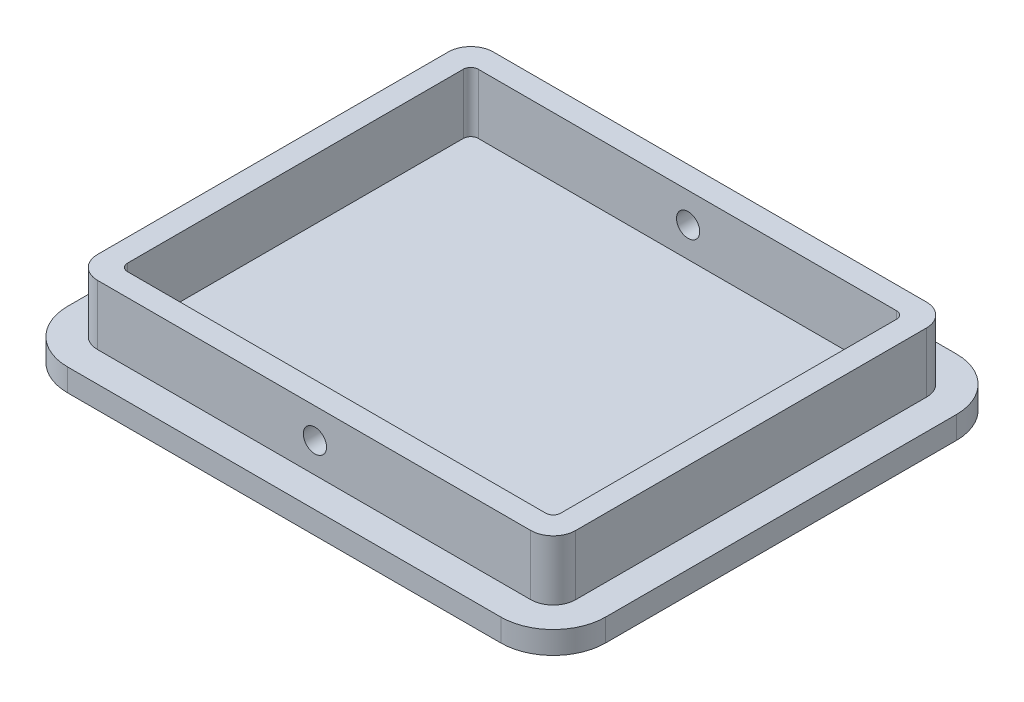
ISO-10303-21;
HEADER;
FILE_DESCRIPTION(('STEP AP214'),'2;1');
FILE_NAME('part.step','',(''),(''),'','','');
FILE_SCHEMA(('AUTOMOTIVE_DESIGN { 1 0 10303 214 1 1 1 1 }'));
ENDSEC;
DATA;
#1=APPLICATION_CONTEXT('core data for automotive mechanical design processes');
#2=APPLICATION_PROTOCOL_DEFINITION('international standard','automotive_design',2000,#1);
#3=PRODUCT_CONTEXT('',#1,'mechanical');
#4=PRODUCT('Part','Part','',(#3));
#5=PRODUCT_RELATED_PRODUCT_CATEGORY('part','',(#4));
#6=PRODUCT_DEFINITION_FORMATION('','',#4);
#7=PRODUCT_DEFINITION_CONTEXT('part definition',#1,'design');
#8=PRODUCT_DEFINITION('design','',#6,#7);
#9=PRODUCT_DEFINITION_SHAPE('','',#8);
#10=(LENGTH_UNIT() NAMED_UNIT(*) SI_UNIT(.MILLI.,.METRE.));
#11=(NAMED_UNIT(*) PLANE_ANGLE_UNIT() SI_UNIT($,.RADIAN.));
#12=(NAMED_UNIT(*) SI_UNIT($,.STERADIAN.) SOLID_ANGLE_UNIT());
#13=UNCERTAINTY_MEASURE_WITH_UNIT(LENGTH_MEASURE(1.E-05),#10,'distance_accuracy_value','');
#14=(GEOMETRIC_REPRESENTATION_CONTEXT(3) GLOBAL_UNCERTAINTY_ASSIGNED_CONTEXT((#13)) GLOBAL_UNIT_ASSIGNED_CONTEXT((#10,
#11,#12)) REPRESENTATION_CONTEXT('',''));
#15=CARTESIAN_POINT('',(0.,0.,0.));
#16=DIRECTION('',(0.,0.,1.));
#17=DIRECTION('',(1.,0.,0.));
#18=AXIS2_PLACEMENT_3D('',#15,#16,#17);
#19=CARTESIAN_POINT('',(28.9,0.,-23.4));
#20=DIRECTION('',(0.,-1.,0.));
#21=DIRECTION('',(0.,0.,-1.));
#22=AXIS2_PLACEMENT_3D('',#19,#20,#21);
#23=PLANE('',#22);
#24=DIRECTION('',(0.,0.,-1.));
#25=VECTOR('',#24,1.);
#26=CARTESIAN_POINT('',(31.9,0.,26.4));
#27=LINE('',#26,#25);
#28=CARTESIAN_POINT('',(31.9,0.,23.4));
#29=VERTEX_POINT('',#28);
#30=CARTESIAN_POINT('',(31.9,0.,-23.4));
#31=VERTEX_POINT('',#30);
#32=EDGE_CURVE('E271',#29,#31,#27,.T.);
#33=ORIENTED_EDGE('',*,*,#32,.F.);
#34=CARTESIAN_POINT('',(28.9,0.,23.4));
#35=DIRECTION('',(0.,-1.,0.));
#36=DIRECTION('',(0.,0.,-1.));
#37=AXIS2_PLACEMENT_3D('',#34,#35,#36);
#38=CIRCLE('',#37,3.);
#39=CARTESIAN_POINT('',(28.9,0.,26.4));
#40=VERTEX_POINT('',#39);
#41=EDGE_CURVE('E177',#29,#40,#38,.T.);
#42=ORIENTED_EDGE('',*,*,#41,.T.);
#43=DIRECTION('',(1.,0.,0.));
#44=VECTOR('',#43,1.);
#45=CARTESIAN_POINT('',(-31.9,0.,26.4));
#46=LINE('',#45,#44);
#47=CARTESIAN_POINT('',(-28.9,0.,26.4));
#48=VERTEX_POINT('',#47);
#49=EDGE_CURVE('E300',#48,#40,#46,.T.);
#50=ORIENTED_EDGE('',*,*,#49,.F.);
#51=CARTESIAN_POINT('',(-28.9,0.,23.4));
#52=DIRECTION('',(0.,-1.,0.));
#53=DIRECTION('',(0.,0.,-1.));
#54=AXIS2_PLACEMENT_3D('',#51,#52,#53);
#55=CIRCLE('',#54,3.);
#56=CARTESIAN_POINT('',(-31.9,0.,23.4));
#57=VERTEX_POINT('',#56);
#58=EDGE_CURVE('E239',#48,#57,#55,.T.);
#59=ORIENTED_EDGE('',*,*,#58,.T.);
#60=DIRECTION('',(0.,0.,1.));
#61=VECTOR('',#60,1.);
#62=CARTESIAN_POINT('',(-31.9,0.,26.4));
#63=LINE('',#62,#61);
#64=CARTESIAN_POINT('',(-31.9,0.,-23.4));
#65=VERTEX_POINT('',#64);
#66=EDGE_CURVE('E287',#65,#57,#63,.T.);
#67=ORIENTED_EDGE('',*,*,#66,.F.);
#68=CARTESIAN_POINT('',(-28.9,0.,-23.4));
#69=DIRECTION('',(0.,-1.,0.));
#70=DIRECTION('',(0.,0.,-1.));
#71=AXIS2_PLACEMENT_3D('',#68,#69,#70);
#72=CIRCLE('',#71,3.);
#73=CARTESIAN_POINT('',(-28.9,0.,-26.4));
#74=VERTEX_POINT('',#73);
#75=EDGE_CURVE('E240',#65,#74,#72,.T.);
#76=ORIENTED_EDGE('',*,*,#75,.T.);
#77=DIRECTION('',(-1.,0.,0.));
#78=VECTOR('',#77,1.);
#79=CARTESIAN_POINT('',(-31.9,0.,-26.4));
#80=LINE('',#79,#78);
#81=CARTESIAN_POINT('',(28.9,0.,-26.4));
#82=VERTEX_POINT('',#81);
#83=EDGE_CURVE('E256',#82,#74,#80,.T.);
#84=ORIENTED_EDGE('',*,*,#83,.F.);
#85=CARTESIAN_POINT('',(28.9,0.,-23.4));
#86=DIRECTION('',(0.,-1.,0.));
#87=DIRECTION('',(0.,0.,-1.));
#88=AXIS2_PLACEMENT_3D('',#85,#86,#87);
#89=CIRCLE('',#88,3.);
#90=EDGE_CURVE('E241',#82,#31,#89,.T.);
#91=ORIENTED_EDGE('',*,*,#90,.T.);
#92=EDGE_LOOP('',(#33,#42,#50,#59,#67,#76,#84,#91));
#93=FACE_BOUND('',#92,.T.);
#94=CARTESIAN_POINT('',(28.9,0.,-23.4));
#95=DIRECTION('',(0.,-1.,0.));
#96=DIRECTION('',(0.,0.,-1.));
#97=AXIS2_PLACEMENT_3D('',#94,#95,#96);
#98=CIRCLE('',#97,7.);
#99=CARTESIAN_POINT('',(28.9,0.,-30.4));
#100=VERTEX_POINT('',#99);
#101=CARTESIAN_POINT('',(35.9,0.,-23.4));
#102=VERTEX_POINT('',#101);
#103=EDGE_CURVE('E144',#100,#102,#98,.T.);
#104=ORIENTED_EDGE('',*,*,#103,.F.);
#105=DIRECTION('',(1.,0.,0.));
#106=VECTOR('',#105,1.);
#107=CARTESIAN_POINT('',(-28.9,0.,-30.4));
#108=LINE('',#107,#106);
#109=CARTESIAN_POINT('',(-28.9,0.,-30.4));
#110=VERTEX_POINT('',#109);
#111=EDGE_CURVE('E27',#110,#100,#108,.T.);
#112=ORIENTED_EDGE('',*,*,#111,.F.);
#113=CARTESIAN_POINT('',(-28.9,0.,-23.4));
#114=DIRECTION('',(0.,-1.,0.));
#115=DIRECTION('',(0.,0.,-1.));
#116=AXIS2_PLACEMENT_3D('',#113,#114,#115);
#117=CIRCLE('',#116,7.);
#118=CARTESIAN_POINT('',(-35.9,0.,-23.4));
#119=VERTEX_POINT('',#118);
#120=EDGE_CURVE('E85',#119,#110,#117,.T.);
#121=ORIENTED_EDGE('',*,*,#120,.F.);
#122=DIRECTION('',(0.,0.,-1.));
#123=VECTOR('',#122,1.);
#124=CARTESIAN_POINT('',(-35.9,0.,23.4));
#125=LINE('',#124,#123);
#126=CARTESIAN_POINT('',(-35.9,0.,23.4));
#127=VERTEX_POINT('',#126);
#128=EDGE_CURVE('E114',#127,#119,#125,.T.);
#129=ORIENTED_EDGE('',*,*,#128,.F.);
#130=CARTESIAN_POINT('',(-28.9,0.,23.4));
#131=DIRECTION('',(0.,-1.,0.));
#132=DIRECTION('',(0.,0.,-1.));
#133=AXIS2_PLACEMENT_3D('',#130,#131,#132);
#134=CIRCLE('',#133,7.);
#135=CARTESIAN_POINT('',(-28.9,0.,30.4));
#136=VERTEX_POINT('',#135);
#137=EDGE_CURVE('E123',#136,#127,#134,.T.);
#138=ORIENTED_EDGE('',*,*,#137,.F.);
#139=DIRECTION('',(-1.,0.,0.));
#140=VECTOR('',#139,1.);
#141=CARTESIAN_POINT('',(28.9,0.,30.4));
#142=LINE('',#141,#140);
#143=CARTESIAN_POINT('',(28.9,0.,30.4));
#144=VERTEX_POINT('',#143);
#145=EDGE_CURVE('E384',#144,#136,#142,.T.);
#146=ORIENTED_EDGE('',*,*,#145,.F.);
#147=CARTESIAN_POINT('',(28.9,0.,23.4));
#148=DIRECTION('',(0.,-1.,0.));
#149=DIRECTION('',(0.,0.,-1.));
#150=AXIS2_PLACEMENT_3D('',#147,#148,#149);
#151=CIRCLE('',#150,7.);
#152=CARTESIAN_POINT('',(35.9,0.,23.4));
#153=VERTEX_POINT('',#152);
#154=EDGE_CURVE('E200',#153,#144,#151,.T.);
#155=ORIENTED_EDGE('',*,*,#154,.F.);
#156=DIRECTION('',(0.,0.,1.));
#157=VECTOR('',#156,1.);
#158=CARTESIAN_POINT('',(35.9,0.,-23.4));
#159=LINE('',#158,#157);
#160=EDGE_CURVE('E146',#102,#153,#159,.T.);
#161=ORIENTED_EDGE('',*,*,#160,.F.);
#162=EDGE_LOOP('',(#104,#112,#121,#129,#138,#146,#155,#161));
#163=FACE_BOUND('',#162,.T.);
#164=ADVANCED_FACE('F16',(#93,#163),#23,.F.);
#165=CARTESIAN_POINT('',(28.9,-3.,-23.4));
#166=DIRECTION('',(0.,-1.,0.));
#167=DIRECTION('',(0.,0.,-1.));
#168=AXIS2_PLACEMENT_3D('',#165,#166,#167);
#169=PLANE('',#168);
#170=CARTESIAN_POINT('',(28.9,-3.,-23.4));
#171=DIRECTION('',(0.,-1.,0.));
#172=DIRECTION('',(0.,0.,-1.));
#173=AXIS2_PLACEMENT_3D('',#170,#171,#172);
#174=CIRCLE('',#173,7.);
#175=CARTESIAN_POINT('',(28.9,-3.,-30.4));
#176=VERTEX_POINT('',#175);
#177=CARTESIAN_POINT('',(35.9,-3.,-23.4));
#178=VERTEX_POINT('',#177);
#179=EDGE_CURVE('E148',#176,#178,#174,.T.);
#180=ORIENTED_EDGE('',*,*,#179,.T.);
#181=DIRECTION('',(0.,0.,1.));
#182=VECTOR('',#181,1.);
#183=CARTESIAN_POINT('',(35.9,-3.,-23.4));
#184=LINE('',#183,#182);
#185=CARTESIAN_POINT('',(35.9,-3.,23.4));
#186=VERTEX_POINT('',#185);
#187=EDGE_CURVE('E204',#178,#186,#184,.T.);
#188=ORIENTED_EDGE('',*,*,#187,.T.);
#189=CARTESIAN_POINT('',(28.9,-3.,23.4));
#190=DIRECTION('',(0.,-1.,0.));
#191=DIRECTION('',(0.,0.,-1.));
#192=AXIS2_PLACEMENT_3D('',#189,#190,#191);
#193=CIRCLE('',#192,7.);
#194=CARTESIAN_POINT('',(28.9,-3.,30.4));
#195=VERTEX_POINT('',#194);
#196=EDGE_CURVE('E381',#186,#195,#193,.T.);
#197=ORIENTED_EDGE('',*,*,#196,.T.);
#198=DIRECTION('',(-1.,0.,0.));
#199=VECTOR('',#198,1.);
#200=CARTESIAN_POINT('',(28.9,-3.,30.4));
#201=LINE('',#200,#199);
#202=CARTESIAN_POINT('',(-28.9,-3.,30.4));
#203=VERTEX_POINT('',#202);
#204=EDGE_CURVE('E392',#195,#203,#201,.T.);
#205=ORIENTED_EDGE('',*,*,#204,.T.);
#206=CARTESIAN_POINT('',(-28.9,-3.,23.4));
#207=DIRECTION('',(0.,-1.,0.));
#208=DIRECTION('',(0.,0.,-1.));
#209=AXIS2_PLACEMENT_3D('',#206,#207,#208);
#210=CIRCLE('',#209,7.);
#211=CARTESIAN_POINT('',(-35.9,-3.,23.4));
#212=VERTEX_POINT('',#211);
#213=EDGE_CURVE('E106',#203,#212,#210,.T.);
#214=ORIENTED_EDGE('',*,*,#213,.T.);
#215=DIRECTION('',(0.,0.,-1.));
#216=VECTOR('',#215,1.);
#217=CARTESIAN_POINT('',(-35.9,-3.,23.4));
#218=LINE('',#217,#216);
#219=CARTESIAN_POINT('',(-35.9,-3.,-23.4));
#220=VERTEX_POINT('',#219);
#221=EDGE_CURVE('E101',#212,#220,#218,.T.);
#222=ORIENTED_EDGE('',*,*,#221,.T.);
#223=CARTESIAN_POINT('',(-28.9,-3.,-23.4));
#224=DIRECTION('',(0.,-1.,0.));
#225=DIRECTION('',(0.,0.,-1.));
#226=AXIS2_PLACEMENT_3D('',#223,#224,#225);
#227=CIRCLE('',#226,7.);
#228=CARTESIAN_POINT('',(-28.9,-3.,-30.4));
#229=VERTEX_POINT('',#228);
#230=EDGE_CURVE('E89',#220,#229,#227,.T.);
#231=ORIENTED_EDGE('',*,*,#230,.T.);
#232=DIRECTION('',(1.,0.,0.));
#233=VECTOR('',#232,1.);
#234=CARTESIAN_POINT('',(-28.9,-3.,-30.4));
#235=LINE('',#234,#233);
#236=EDGE_CURVE('E10',#229,#176,#235,.T.);
#237=ORIENTED_EDGE('',*,*,#236,.T.);
#238=EDGE_LOOP('',(#180,#188,#197,#205,#214,#222,#231,#237));
#239=FACE_BOUND('',#238,.T.);
#240=ADVANCED_FACE('F103',(#239),#169,.T.);
#241=CARTESIAN_POINT('',(-28.9,-3.,-30.4));
#242=DIRECTION('',(0.,0.,1.));
#243=DIRECTION('',(1.,0.,0.));
#244=AXIS2_PLACEMENT_3D('',#241,#242,#243);
#245=PLANE('',#244);
#246=ORIENTED_EDGE('',*,*,#111,.T.);
#247=DIRECTION('',(0.,1.,0.));
#248=VECTOR('',#247,1.);
#249=CARTESIAN_POINT('',(28.9,-3.,-30.4));
#250=LINE('',#249,#248);
#251=EDGE_CURVE('E133',#176,#100,#250,.T.);
#252=ORIENTED_EDGE('',*,*,#251,.F.);
#253=ORIENTED_EDGE('',*,*,#236,.F.);
#254=DIRECTION('',(0.,1.,0.));
#255=VECTOR('',#254,1.);
#256=CARTESIAN_POINT('',(-28.9,-3.,-30.4));
#257=LINE('',#256,#255);
#258=EDGE_CURVE('E96',#229,#110,#257,.T.);
#259=ORIENTED_EDGE('',*,*,#258,.T.);
#260=EDGE_LOOP('',(#246,#252,#253,#259));
#261=FACE_BOUND('',#260,.T.);
#262=ADVANCED_FACE('F18',(#261),#245,.F.);
#263=CARTESIAN_POINT('',(-28.9,-3.,-23.4));
#264=DIRECTION('',(0.,1.,0.));
#265=DIRECTION('',(0.,0.,1.));
#266=AXIS2_PLACEMENT_3D('',#263,#264,#265);
#267=CYLINDRICAL_SURFACE('',#266,7.);
#268=ORIENTED_EDGE('',*,*,#120,.T.);
#269=ORIENTED_EDGE('',*,*,#258,.F.);
#270=ORIENTED_EDGE('',*,*,#230,.F.);
#271=DIRECTION('',(0.,1.,0.));
#272=VECTOR('',#271,1.);
#273=CARTESIAN_POINT('',(-35.9,-3.,-23.4));
#274=LINE('',#273,#272);
#275=EDGE_CURVE('E94',#220,#119,#274,.T.);
#276=ORIENTED_EDGE('',*,*,#275,.T.);
#277=EDGE_LOOP('',(#268,#269,#270,#276));
#278=FACE_BOUND('',#277,.T.);
#279=ADVANCED_FACE('F95',(#278),#267,.T.);
#280=CARTESIAN_POINT('',(-35.9,-3.,23.4));
#281=DIRECTION('',(1.,0.,0.));
#282=DIRECTION('',(0.,1.,0.));
#283=AXIS2_PLACEMENT_3D('',#280,#281,#282);
#284=PLANE('',#283);
#285=ORIENTED_EDGE('',*,*,#128,.T.);
#286=ORIENTED_EDGE('',*,*,#275,.F.);
#287=ORIENTED_EDGE('',*,*,#221,.F.);
#288=DIRECTION('',(0.,1.,0.));
#289=VECTOR('',#288,1.);
#290=CARTESIAN_POINT('',(-35.9,-3.,23.4));
#291=LINE('',#290,#289);
#292=EDGE_CURVE('E314',#212,#127,#291,.T.);
#293=ORIENTED_EDGE('',*,*,#292,.T.);
#294=EDGE_LOOP('',(#285,#286,#287,#293));
#295=FACE_BOUND('',#294,.T.);
#296=ADVANCED_FACE('F115',(#295),#284,.F.);
#297=CARTESIAN_POINT('',(-28.9,-3.,23.4));
#298=DIRECTION('',(0.,1.,0.));
#299=DIRECTION('',(0.,0.,1.));
#300=AXIS2_PLACEMENT_3D('',#297,#298,#299);
#301=CYLINDRICAL_SURFACE('',#300,7.);
#302=ORIENTED_EDGE('',*,*,#137,.T.);
#303=ORIENTED_EDGE('',*,*,#292,.F.);
#304=ORIENTED_EDGE('',*,*,#213,.F.);
#305=DIRECTION('',(0.,1.,0.));
#306=VECTOR('',#305,1.);
#307=CARTESIAN_POINT('',(-28.9,-3.,30.4));
#308=LINE('',#307,#306);
#309=EDGE_CURVE('E386',#203,#136,#308,.T.);
#310=ORIENTED_EDGE('',*,*,#309,.T.);
#311=EDGE_LOOP('',(#302,#303,#304,#310));
#312=FACE_BOUND('',#311,.T.);
#313=ADVANCED_FACE('F401',(#312),#301,.T.);
#314=CARTESIAN_POINT('',(28.9,-3.,30.4));
#315=DIRECTION('',(0.,0.,-1.));
#316=DIRECTION('',(0.,-1.,0.));
#317=AXIS2_PLACEMENT_3D('',#314,#315,#316);
#318=PLANE('',#317);
#319=ORIENTED_EDGE('',*,*,#145,.T.);
#320=ORIENTED_EDGE('',*,*,#309,.F.);
#321=ORIENTED_EDGE('',*,*,#204,.F.);
#322=DIRECTION('',(0.,1.,0.));
#323=VECTOR('',#322,1.);
#324=CARTESIAN_POINT('',(28.9,-3.,30.4));
#325=LINE('',#324,#323);
#326=EDGE_CURVE('E201',#195,#144,#325,.T.);
#327=ORIENTED_EDGE('',*,*,#326,.T.);
#328=EDGE_LOOP('',(#319,#320,#321,#327));
#329=FACE_BOUND('',#328,.T.);
#330=ADVANCED_FACE('F404',(#329),#318,.F.);
#331=CARTESIAN_POINT('',(28.9,-3.,23.4));
#332=DIRECTION('',(0.,1.,0.));
#333=DIRECTION('',(0.,0.,1.));
#334=AXIS2_PLACEMENT_3D('',#331,#332,#333);
#335=CYLINDRICAL_SURFACE('',#334,7.);
#336=ORIENTED_EDGE('',*,*,#154,.T.);
#337=ORIENTED_EDGE('',*,*,#326,.F.);
#338=ORIENTED_EDGE('',*,*,#196,.F.);
#339=DIRECTION('',(0.,1.,0.));
#340=VECTOR('',#339,1.);
#341=CARTESIAN_POINT('',(35.9,-3.,23.4));
#342=LINE('',#341,#340);
#343=EDGE_CURVE('E249',#186,#153,#342,.T.);
#344=ORIENTED_EDGE('',*,*,#343,.T.);
#345=EDGE_LOOP('',(#336,#337,#338,#344));
#346=FACE_BOUND('',#345,.T.);
#347=ADVANCED_FACE('F410',(#346),#335,.T.);
#348=CARTESIAN_POINT('',(35.9,-3.,-23.4));
#349=DIRECTION('',(-1.,0.,0.));
#350=DIRECTION('',(0.,0.,1.));
#351=AXIS2_PLACEMENT_3D('',#348,#349,#350);
#352=PLANE('',#351);
#353=ORIENTED_EDGE('',*,*,#160,.T.);
#354=ORIENTED_EDGE('',*,*,#343,.F.);
#355=ORIENTED_EDGE('',*,*,#187,.F.);
#356=DIRECTION('',(0.,1.,0.));
#357=VECTOR('',#356,1.);
#358=CARTESIAN_POINT('',(35.9,-3.,-23.4));
#359=LINE('',#358,#357);
#360=EDGE_CURVE('E154',#178,#102,#359,.T.);
#361=ORIENTED_EDGE('',*,*,#360,.T.);
#362=EDGE_LOOP('',(#353,#354,#355,#361));
#363=FACE_BOUND('',#362,.T.);
#364=ADVANCED_FACE('F413',(#363),#352,.F.);
#365=CARTESIAN_POINT('',(28.9,-3.,-23.4));
#366=DIRECTION('',(0.,1.,0.));
#367=DIRECTION('',(0.,0.,1.));
#368=AXIS2_PLACEMENT_3D('',#365,#366,#367);
#369=CYLINDRICAL_SURFACE('',#368,7.);
#370=ORIENTED_EDGE('',*,*,#103,.T.);
#371=ORIENTED_EDGE('',*,*,#360,.F.);
#372=ORIENTED_EDGE('',*,*,#179,.F.);
#373=ORIENTED_EDGE('',*,*,#251,.T.);
#374=EDGE_LOOP('',(#370,#371,#372,#373));
#375=FACE_BOUND('',#374,.T.);
#376=ADVANCED_FACE('F141',(#375),#369,.T.);
#377=CARTESIAN_POINT('',(28.9,0.,-23.4));
#378=DIRECTION('',(0.,-1.,0.));
#379=DIRECTION('',(0.,0.,-1.));
#380=AXIS2_PLACEMENT_3D('',#377,#378,#379);
#381=PLANE('',#380);
#382=CARTESIAN_POINT('',(27.9,0.,22.4));
#383=DIRECTION('',(0.,1.,0.));
#384=DIRECTION('',(0.,0.,-1.));
#385=AXIS2_PLACEMENT_3D('',#382,#383,#384);
#386=CIRCLE('',#385,1.);
#387=CARTESIAN_POINT('',(27.9,0.,23.4));
#388=VERTEX_POINT('',#387);
#389=CARTESIAN_POINT('',(28.9,0.,22.4));
#390=VERTEX_POINT('',#389);
#391=EDGE_CURVE('E362',#388,#390,#386,.T.);
#392=ORIENTED_EDGE('',*,*,#391,.T.);
#393=DIRECTION('',(0.,0.,-1.));
#394=VECTOR('',#393,1.);
#395=CARTESIAN_POINT('',(28.9,0.,23.4));
#396=LINE('',#395,#394);
#397=CARTESIAN_POINT('',(28.9,0.,-22.4));
#398=VERTEX_POINT('',#397);
#399=EDGE_CURVE('E217',#390,#398,#396,.T.);
#400=ORIENTED_EDGE('',*,*,#399,.T.);
#401=CARTESIAN_POINT('',(27.9,0.,-22.4));
#402=DIRECTION('',(0.,1.,0.));
#403=DIRECTION('',(0.,0.,-1.));
#404=AXIS2_PLACEMENT_3D('',#401,#402,#403);
#405=CIRCLE('',#404,1.);
#406=CARTESIAN_POINT('',(27.9,0.,-23.4));
#407=VERTEX_POINT('',#406);
#408=EDGE_CURVE('E163',#398,#407,#405,.T.);
#409=ORIENTED_EDGE('',*,*,#408,.T.);
#410=DIRECTION('',(-1.,0.,0.));
#411=VECTOR('',#410,1.);
#412=CARTESIAN_POINT('',(-28.9,0.,-23.4));
#413=LINE('',#412,#411);
#414=CARTESIAN_POINT('',(-27.9,0.,-23.4));
#415=VERTEX_POINT('',#414);
#416=EDGE_CURVE('E344',#407,#415,#413,.T.);
#417=ORIENTED_EDGE('',*,*,#416,.T.);
#418=CARTESIAN_POINT('',(-27.9,0.,-22.4));
#419=DIRECTION('',(0.,1.,0.));
#420=DIRECTION('',(0.,0.,-1.));
#421=AXIS2_PLACEMENT_3D('',#418,#419,#420);
#422=CIRCLE('',#421,1.);
#423=CARTESIAN_POINT('',(-28.9,0.,-22.4));
#424=VERTEX_POINT('',#423);
#425=EDGE_CURVE('E156',#415,#424,#422,.T.);
#426=ORIENTED_EDGE('',*,*,#425,.T.);
#427=DIRECTION('',(0.,0.,1.));
#428=VECTOR('',#427,1.);
#429=CARTESIAN_POINT('',(-28.9,0.,23.4));
#430=LINE('',#429,#428);
#431=CARTESIAN_POINT('',(-28.9,0.,22.4));
#432=VERTEX_POINT('',#431);
#433=EDGE_CURVE('E311',#424,#432,#430,.T.);
#434=ORIENTED_EDGE('',*,*,#433,.T.);
#435=CARTESIAN_POINT('',(-27.9,0.,22.4));
#436=DIRECTION('',(0.,1.,0.));
#437=DIRECTION('',(0.,0.,-1.));
#438=AXIS2_PLACEMENT_3D('',#435,#436,#437);
#439=CIRCLE('',#438,1.);
#440=CARTESIAN_POINT('',(-27.9,0.,23.4));
#441=VERTEX_POINT('',#440);
#442=EDGE_CURVE('E358',#432,#441,#439,.T.);
#443=ORIENTED_EDGE('',*,*,#442,.T.);
#444=DIRECTION('',(1.,0.,0.));
#445=VECTOR('',#444,1.);
#446=CARTESIAN_POINT('',(-28.9,0.,23.4));
#447=LINE('',#446,#445);
#448=EDGE_CURVE('E330',#441,#388,#447,.T.);
#449=ORIENTED_EDGE('',*,*,#448,.T.);
#450=EDGE_LOOP('',(#392,#400,#409,#417,#426,#434,#443,#449));
#451=FACE_BOUND('',#450,.T.);
#452=ADVANCED_FACE('F704',(#451),#381,.F.);
#453=CARTESIAN_POINT('',(-27.9,8.,-22.4));
#454=DIRECTION('',(0.,1.,0.));
#455=DIRECTION('',(0.,0.,1.));
#456=AXIS2_PLACEMENT_3D('',#453,#454,#455);
#457=CYLINDRICAL_SURFACE('',#456,1.);
#458=CARTESIAN_POINT('',(-27.9,8.,-22.4));
#459=DIRECTION('',(0.,-1.,0.));
#460=DIRECTION('',(0.,0.,-1.));
#461=AXIS2_PLACEMENT_3D('',#458,#459,#460);
#462=CIRCLE('',#461,1.);
#463=CARTESIAN_POINT('',(-28.9,8.,-22.4));
#464=VERTEX_POINT('',#463);
#465=CARTESIAN_POINT('',(-27.9,8.,-23.4));
#466=VERTEX_POINT('',#465);
#467=EDGE_CURVE('E220',#464,#466,#462,.T.);
#468=ORIENTED_EDGE('',*,*,#467,.F.);
#469=DIRECTION('',(0.,1.,0.));
#470=VECTOR('',#469,1.);
#471=CARTESIAN_POINT('',(-28.9,8.,-22.4));
#472=LINE('',#471,#470);
#473=EDGE_CURVE('E317',#424,#464,#472,.T.);
#474=ORIENTED_EDGE('',*,*,#473,.F.);
#475=ORIENTED_EDGE('',*,*,#425,.F.);
#476=DIRECTION('',(0.,-1.,0.));
#477=VECTOR('',#476,1.);
#478=CARTESIAN_POINT('',(-27.9,0.,-23.4));
#479=LINE('',#478,#477);
#480=EDGE_CURVE('E175',#466,#415,#479,.T.);
#481=ORIENTED_EDGE('',*,*,#480,.F.);
#482=EDGE_LOOP('',(#468,#474,#475,#481));
#483=FACE_BOUND('',#482,.T.);
#484=ADVANCED_FACE('F714',(#483),#457,.F.);
#485=CARTESIAN_POINT('',(27.9,8.,-22.4));
#486=DIRECTION('',(0.,1.,0.));
#487=DIRECTION('',(0.,0.,1.));
#488=AXIS2_PLACEMENT_3D('',#485,#486,#487);
#489=CYLINDRICAL_SURFACE('',#488,1.);
#490=CARTESIAN_POINT('',(27.9,8.,-22.4));
#491=DIRECTION('',(0.,-1.,0.));
#492=DIRECTION('',(0.,0.,-1.));
#493=AXIS2_PLACEMENT_3D('',#490,#491,#492);
#494=CIRCLE('',#493,1.);
#495=CARTESIAN_POINT('',(27.9,8.,-23.4));
#496=VERTEX_POINT('',#495);
#497=CARTESIAN_POINT('',(28.9,8.,-22.4));
#498=VERTEX_POINT('',#497);
#499=EDGE_CURVE('E231',#496,#498,#494,.T.);
#500=ORIENTED_EDGE('',*,*,#499,.F.);
#501=DIRECTION('',(0.,1.,0.));
#502=VECTOR('',#501,1.);
#503=CARTESIAN_POINT('',(27.9,8.,-23.4));
#504=LINE('',#503,#502);
#505=EDGE_CURVE('E179',#407,#496,#504,.T.);
#506=ORIENTED_EDGE('',*,*,#505,.F.);
#507=ORIENTED_EDGE('',*,*,#408,.F.);
#508=DIRECTION('',(0.,-1.,0.));
#509=VECTOR('',#508,1.);
#510=CARTESIAN_POINT('',(28.9,0.,-22.4));
#511=LINE('',#510,#509);
#512=EDGE_CURVE('E340',#498,#398,#511,.T.);
#513=ORIENTED_EDGE('',*,*,#512,.F.);
#514=EDGE_LOOP('',(#500,#506,#507,#513));
#515=FACE_BOUND('',#514,.T.);
#516=ADVANCED_FACE('F726',(#515),#489,.F.);
#517=CARTESIAN_POINT('',(27.9,8.,22.4));
#518=DIRECTION('',(0.,1.,0.));
#519=DIRECTION('',(0.,0.,1.));
#520=AXIS2_PLACEMENT_3D('',#517,#518,#519);
#521=CYLINDRICAL_SURFACE('',#520,1.);
#522=CARTESIAN_POINT('',(27.9,8.,22.4));
#523=DIRECTION('',(0.,-1.,0.));
#524=DIRECTION('',(0.,0.,-1.));
#525=AXIS2_PLACEMENT_3D('',#522,#523,#524);
#526=CIRCLE('',#525,1.);
#527=CARTESIAN_POINT('',(28.9,8.,22.4));
#528=VERTEX_POINT('',#527);
#529=CARTESIAN_POINT('',(27.9,8.,23.4));
#530=VERTEX_POINT('',#529);
#531=EDGE_CURVE('E244',#528,#530,#526,.T.);
#532=ORIENTED_EDGE('',*,*,#531,.F.);
#533=DIRECTION('',(0.,1.,0.));
#534=VECTOR('',#533,1.);
#535=CARTESIAN_POINT('',(28.9,8.,22.4));
#536=LINE('',#535,#534);
#537=EDGE_CURVE('E225',#390,#528,#536,.T.);
#538=ORIENTED_EDGE('',*,*,#537,.F.);
#539=ORIENTED_EDGE('',*,*,#391,.F.);
#540=DIRECTION('',(0.,-1.,0.));
#541=VECTOR('',#540,1.);
#542=CARTESIAN_POINT('',(27.9,0.,23.4));
#543=LINE('',#542,#541);
#544=EDGE_CURVE('E224',#530,#388,#543,.T.);
#545=ORIENTED_EDGE('',*,*,#544,.F.);
#546=EDGE_LOOP('',(#532,#538,#539,#545));
#547=FACE_BOUND('',#546,.T.);
#548=ADVANCED_FACE('F740',(#547),#521,.F.);
#549=CARTESIAN_POINT('',(-27.9,8.,22.4));
#550=DIRECTION('',(0.,1.,0.));
#551=DIRECTION('',(0.,0.,1.));
#552=AXIS2_PLACEMENT_3D('',#549,#550,#551);
#553=CYLINDRICAL_SURFACE('',#552,1.);
#554=CARTESIAN_POINT('',(-27.9,8.,22.4));
#555=DIRECTION('',(0.,-1.,0.));
#556=DIRECTION('',(0.,0.,-1.));
#557=AXIS2_PLACEMENT_3D('',#554,#555,#556);
#558=CIRCLE('',#557,1.);
#559=CARTESIAN_POINT('',(-27.9,8.,23.4));
#560=VERTEX_POINT('',#559);
#561=CARTESIAN_POINT('',(-28.9,8.,22.4));
#562=VERTEX_POINT('',#561);
#563=EDGE_CURVE('E263',#560,#562,#558,.T.);
#564=ORIENTED_EDGE('',*,*,#563,.F.);
#565=DIRECTION('',(0.,1.,0.));
#566=VECTOR('',#565,1.);
#567=CARTESIAN_POINT('',(-27.9,8.,23.4));
#568=LINE('',#567,#566);
#569=EDGE_CURVE('E332',#441,#560,#568,.T.);
#570=ORIENTED_EDGE('',*,*,#569,.F.);
#571=ORIENTED_EDGE('',*,*,#442,.F.);
#572=DIRECTION('',(0.,-1.,0.));
#573=VECTOR('',#572,1.);
#574=CARTESIAN_POINT('',(-28.9,0.,22.4));
#575=LINE('',#574,#573);
#576=EDGE_CURVE('E310',#562,#432,#575,.T.);
#577=ORIENTED_EDGE('',*,*,#576,.F.);
#578=EDGE_LOOP('',(#564,#570,#571,#577));
#579=FACE_BOUND('',#578,.T.);
#580=ADVANCED_FACE('F746',(#579),#553,.F.);
#581=CARTESIAN_POINT('',(-28.9,8.,23.4));
#582=DIRECTION('',(0.,-1.,0.));
#583=DIRECTION('',(0.,0.,-1.));
#584=AXIS2_PLACEMENT_3D('',#581,#582,#583);
#585=CYLINDRICAL_SURFACE('',#584,3.);
#586=CARTESIAN_POINT('',(-28.9,8.,23.4));
#587=DIRECTION('',(0.,1.,0.));
#588=DIRECTION('',(0.,0.,-1.));
#589=AXIS2_PLACEMENT_3D('',#586,#587,#588);
#590=CIRCLE('',#589,3.);
#591=CARTESIAN_POINT('',(-31.9,8.,23.4));
#592=VERTEX_POINT('',#591);
#593=CARTESIAN_POINT('',(-28.9,8.,26.4));
#594=VERTEX_POINT('',#593);
#595=EDGE_CURVE('E215',#592,#594,#590,.T.);
#596=ORIENTED_EDGE('',*,*,#595,.F.);
#597=DIRECTION('',(0.,1.,0.));
#598=VECTOR('',#597,1.);
#599=CARTESIAN_POINT('',(-31.9,8.,23.4));
#600=LINE('',#599,#598);
#601=EDGE_CURVE('E293',#57,#592,#600,.T.);
#602=ORIENTED_EDGE('',*,*,#601,.F.);
#603=ORIENTED_EDGE('',*,*,#58,.F.);
#604=DIRECTION('',(0.,-1.,0.));
#605=VECTOR('',#604,1.);
#606=CARTESIAN_POINT('',(-28.9,8.,26.4));
#607=LINE('',#606,#605);
#608=EDGE_CURVE('E304',#594,#48,#607,.T.);
#609=ORIENTED_EDGE('',*,*,#608,.F.);
#610=EDGE_LOOP('',(#596,#602,#603,#609));
#611=FACE_BOUND('',#610,.T.);
#612=ADVANCED_FACE('F757',(#611),#585,.T.);
#613=CARTESIAN_POINT('',(-28.9,8.,-23.4));
#614=DIRECTION('',(0.,-1.,0.));
#615=DIRECTION('',(0.,0.,-1.));
#616=AXIS2_PLACEMENT_3D('',#613,#614,#615);
#617=CYLINDRICAL_SURFACE('',#616,3.);
#618=CARTESIAN_POINT('',(-28.9,8.,-23.4));
#619=DIRECTION('',(0.,1.,0.));
#620=DIRECTION('',(0.,0.,-1.));
#621=AXIS2_PLACEMENT_3D('',#618,#619,#620);
#622=CIRCLE('',#621,3.);
#623=CARTESIAN_POINT('',(-28.9,8.,-26.4));
#624=VERTEX_POINT('',#623);
#625=CARTESIAN_POINT('',(-31.9,8.,-23.4));
#626=VERTEX_POINT('',#625);
#627=EDGE_CURVE('E196',#624,#626,#622,.T.);
#628=ORIENTED_EDGE('',*,*,#627,.F.);
#629=DIRECTION('',(0.,1.,0.));
#630=VECTOR('',#629,1.);
#631=CARTESIAN_POINT('',(-28.9,8.,-26.4));
#632=LINE('',#631,#630);
#633=EDGE_CURVE('E281',#74,#624,#632,.T.);
#634=ORIENTED_EDGE('',*,*,#633,.F.);
#635=ORIENTED_EDGE('',*,*,#75,.F.);
#636=DIRECTION('',(0.,-1.,0.));
#637=VECTOR('',#636,1.);
#638=CARTESIAN_POINT('',(-31.9,8.,-23.4));
#639=LINE('',#638,#637);
#640=EDGE_CURVE('E285',#626,#65,#639,.T.);
#641=ORIENTED_EDGE('',*,*,#640,.F.);
#642=EDGE_LOOP('',(#628,#634,#635,#641));
#643=FACE_BOUND('',#642,.T.);
#644=ADVANCED_FACE('F769',(#643),#617,.T.);
#645=CARTESIAN_POINT('',(28.9,8.,-23.4));
#646=DIRECTION('',(0.,-1.,0.));
#647=DIRECTION('',(0.,0.,-1.));
#648=AXIS2_PLACEMENT_3D('',#645,#646,#647);
#649=CYLINDRICAL_SURFACE('',#648,3.);
#650=CARTESIAN_POINT('',(28.9,8.,-23.4));
#651=DIRECTION('',(0.,1.,0.));
#652=DIRECTION('',(0.,0.,-1.));
#653=AXIS2_PLACEMENT_3D('',#650,#651,#652);
#654=CIRCLE('',#653,3.);
#655=CARTESIAN_POINT('',(31.9,8.,-23.4));
#656=VERTEX_POINT('',#655);
#657=CARTESIAN_POINT('',(28.9,8.,-26.4));
#658=VERTEX_POINT('',#657);
#659=EDGE_CURVE('E189',#656,#658,#654,.T.);
#660=ORIENTED_EDGE('',*,*,#659,.F.);
#661=DIRECTION('',(0.,1.,0.));
#662=VECTOR('',#661,1.);
#663=CARTESIAN_POINT('',(31.9,8.,-23.4));
#664=LINE('',#663,#662);
#665=EDGE_CURVE('E259',#31,#656,#664,.T.);
#666=ORIENTED_EDGE('',*,*,#665,.F.);
#667=ORIENTED_EDGE('',*,*,#90,.F.);
#668=DIRECTION('',(0.,-1.,0.));
#669=VECTOR('',#668,1.);
#670=CARTESIAN_POINT('',(28.9,8.,-26.4));
#671=LINE('',#670,#669);
#672=EDGE_CURVE('E255',#658,#82,#671,.T.);
#673=ORIENTED_EDGE('',*,*,#672,.F.);
#674=EDGE_LOOP('',(#660,#666,#667,#673));
#675=FACE_BOUND('',#674,.T.);
#676=ADVANCED_FACE('F782',(#675),#649,.T.);
#677=CARTESIAN_POINT('',(28.9,8.,23.4));
#678=DIRECTION('',(0.,-1.,0.));
#679=DIRECTION('',(0.,0.,-1.));
#680=AXIS2_PLACEMENT_3D('',#677,#678,#679);
#681=CYLINDRICAL_SURFACE('',#680,3.);
#682=CARTESIAN_POINT('',(28.9,8.,23.4));
#683=DIRECTION('',(0.,1.,0.));
#684=DIRECTION('',(0.,0.,-1.));
#685=AXIS2_PLACEMENT_3D('',#682,#683,#684);
#686=CIRCLE('',#685,3.);
#687=CARTESIAN_POINT('',(28.9,8.,26.4));
#688=VERTEX_POINT('',#687);
#689=CARTESIAN_POINT('',(31.9,8.,23.4));
#690=VERTEX_POINT('',#689);
#691=EDGE_CURVE('E185',#688,#690,#686,.T.);
#692=ORIENTED_EDGE('',*,*,#691,.F.);
#693=DIRECTION('',(0.,1.,0.));
#694=VECTOR('',#693,1.);
#695=CARTESIAN_POINT('',(28.9,8.,26.4));
#696=LINE('',#695,#694);
#697=EDGE_CURVE('E301',#40,#688,#696,.T.);
#698=ORIENTED_EDGE('',*,*,#697,.F.);
#699=ORIENTED_EDGE('',*,*,#41,.F.);
#700=DIRECTION('',(0.,-1.,0.));
#701=VECTOR('',#700,1.);
#702=CARTESIAN_POINT('',(31.9,8.,23.4));
#703=LINE('',#702,#701);
#704=EDGE_CURVE('E266',#690,#29,#703,.T.);
#705=ORIENTED_EDGE('',*,*,#704,.F.);
#706=EDGE_LOOP('',(#692,#698,#699,#705));
#707=FACE_BOUND('',#706,.T.);
#708=ADVANCED_FACE('F779',(#707),#681,.T.);
#709=CARTESIAN_POINT('',(-28.9,8.,-23.4));
#710=DIRECTION('',(0.,0.,1.));
#711=DIRECTION('',(1.,0.,0.));
#712=AXIS2_PLACEMENT_3D('',#709,#710,#711);
#713=PLANE('',#712);
#714=CARTESIAN_POINT('',(0.100000000000003,4.,-23.4));
#715=DIRECTION('',(0.,0.,1.));
#716=DIRECTION('',(1.,0.,0.));
#717=AXIS2_PLACEMENT_3D('',#714,#715,#716);
#718=CIRCLE('',#717,1.55);
#719=CARTESIAN_POINT('',(1.65,4.,-23.4));
#720=VERTEX_POINT('',#719);
#721=EDGE_CURVE('E168',#720,#720,#718,.T.);
#722=ORIENTED_EDGE('',*,*,#721,.F.);
#723=EDGE_LOOP('',(#722));
#724=FACE_BOUND('',#723,.T.);
#725=ORIENTED_EDGE('',*,*,#416,.F.);
#726=ORIENTED_EDGE('',*,*,#505,.T.);
#727=DIRECTION('',(-1.,0.,0.));
#728=VECTOR('',#727,1.);
#729=CARTESIAN_POINT('',(-28.9,8.,-23.4));
#730=LINE('',#729,#728);
#731=EDGE_CURVE('E227',#496,#466,#730,.T.);
#732=ORIENTED_EDGE('',*,*,#731,.T.);
#733=ORIENTED_EDGE('',*,*,#480,.T.);
#734=EDGE_LOOP('',(#725,#726,#732,#733));
#735=FACE_BOUND('',#734,.T.);
#736=ADVANCED_FACE('F783',(#724,#735),#713,.T.);
#737=CARTESIAN_POINT('',(28.9,8.,23.4));
#738=DIRECTION('',(-1.,0.,0.));
#739=DIRECTION('',(0.,0.,1.));
#740=AXIS2_PLACEMENT_3D('',#737,#738,#739);
#741=PLANE('',#740);
#742=ORIENTED_EDGE('',*,*,#399,.F.);
#743=ORIENTED_EDGE('',*,*,#537,.T.);
#744=DIRECTION('',(0.,0.,-1.));
#745=VECTOR('',#744,1.);
#746=CARTESIAN_POINT('',(28.9,8.,23.4));
#747=LINE('',#746,#745);
#748=EDGE_CURVE('E234',#528,#498,#747,.T.);
#749=ORIENTED_EDGE('',*,*,#748,.T.);
#750=ORIENTED_EDGE('',*,*,#512,.T.);
#751=EDGE_LOOP('',(#742,#743,#749,#750));
#752=FACE_BOUND('',#751,.T.);
#753=ADVANCED_FACE('F796',(#752),#741,.T.);
#754=CARTESIAN_POINT('',(-28.9,8.,23.4));
#755=DIRECTION('',(0.,0.,-1.));
#756=DIRECTION('',(0.,-1.,0.));
#757=AXIS2_PLACEMENT_3D('',#754,#755,#756);
#758=PLANE('',#757);
#759=CARTESIAN_POINT('',(0.100000000000003,4.,23.4));
#760=DIRECTION('',(0.,0.,-1.));
#761=DIRECTION('',(-1.,0.,0.));
#762=AXIS2_PLACEMENT_3D('',#759,#760,#761);
#763=CIRCLE('',#762,1.55);
#764=CARTESIAN_POINT('',(-1.45,4.,23.4));
#765=VERTEX_POINT('',#764);
#766=EDGE_CURVE('E173',#765,#765,#763,.T.);
#767=ORIENTED_EDGE('',*,*,#766,.F.);
#768=EDGE_LOOP('',(#767));
#769=FACE_BOUND('',#768,.T.);
#770=ORIENTED_EDGE('',*,*,#448,.F.);
#771=ORIENTED_EDGE('',*,*,#569,.T.);
#772=DIRECTION('',(1.,0.,0.));
#773=VECTOR('',#772,1.);
#774=CARTESIAN_POINT('',(-28.9,8.,23.4));
#775=LINE('',#774,#773);
#776=EDGE_CURVE('E247',#560,#530,#775,.T.);
#777=ORIENTED_EDGE('',*,*,#776,.T.);
#778=ORIENTED_EDGE('',*,*,#544,.T.);
#779=EDGE_LOOP('',(#770,#771,#777,#778));
#780=FACE_BOUND('',#779,.T.);
#781=ADVANCED_FACE('F810',(#769,#780),#758,.T.);
#782=CARTESIAN_POINT('',(-28.9,8.,23.4));
#783=DIRECTION('',(1.,0.,0.));
#784=DIRECTION('',(0.,1.,0.));
#785=AXIS2_PLACEMENT_3D('',#782,#783,#784);
#786=PLANE('',#785);
#787=DIRECTION('',(0.,0.,1.));
#788=VECTOR('',#787,1.);
#789=CARTESIAN_POINT('',(-28.9,8.,23.4));
#790=LINE('',#789,#788);
#791=EDGE_CURVE('E213',#464,#562,#790,.T.);
#792=ORIENTED_EDGE('',*,*,#791,.T.);
#793=ORIENTED_EDGE('',*,*,#576,.T.);
#794=ORIENTED_EDGE('',*,*,#433,.F.);
#795=ORIENTED_EDGE('',*,*,#473,.T.);
#796=EDGE_LOOP('',(#792,#793,#794,#795));
#797=FACE_BOUND('',#796,.T.);
#798=ADVANCED_FACE('F823',(#797),#786,.T.);
#799=CARTESIAN_POINT('',(-31.9,8.,26.4));
#800=DIRECTION('',(0.,0.,-1.));
#801=DIRECTION('',(0.,-1.,0.));
#802=AXIS2_PLACEMENT_3D('',#799,#800,#801);
#803=PLANE('',#802);
#804=CARTESIAN_POINT('',(0.100000000000003,4.,26.4));
#805=DIRECTION('',(0.,0.,-1.));
#806=DIRECTION('',(-1.,0.,0.));
#807=AXIS2_PLACEMENT_3D('',#804,#805,#806);
#808=CIRCLE('',#807,1.55);
#809=CARTESIAN_POINT('',(-1.45,4.,26.4));
#810=VERTEX_POINT('',#809);
#811=EDGE_CURVE('E1318',#810,#810,#808,.T.);
#812=ORIENTED_EDGE('',*,*,#811,.T.);
#813=EDGE_LOOP('',(#812));
#814=FACE_BOUND('',#813,.T.);
#815=ORIENTED_EDGE('',*,*,#49,.T.);
#816=ORIENTED_EDGE('',*,*,#697,.T.);
#817=DIRECTION('',(1.,0.,0.));
#818=VECTOR('',#817,1.);
#819=CARTESIAN_POINT('',(-31.9,8.,26.4));
#820=LINE('',#819,#818);
#821=EDGE_CURVE('E186',#594,#688,#820,.T.);
#822=ORIENTED_EDGE('',*,*,#821,.F.);
#823=ORIENTED_EDGE('',*,*,#608,.T.);
#824=EDGE_LOOP('',(#815,#816,#822,#823));
#825=FACE_BOUND('',#824,.T.);
#826=ADVANCED_FACE('F826',(#814,#825),#803,.F.);
#827=CARTESIAN_POINT('',(-31.9,8.,26.4));
#828=DIRECTION('',(1.,0.,0.));
#829=DIRECTION('',(0.,1.,0.));
#830=AXIS2_PLACEMENT_3D('',#827,#828,#829);
#831=PLANE('',#830);
#832=DIRECTION('',(0.,0.,1.));
#833=VECTOR('',#832,1.);
#834=CARTESIAN_POINT('',(-31.9,8.,26.4));
#835=LINE('',#834,#833);
#836=EDGE_CURVE('E208',#626,#592,#835,.T.);
#837=ORIENTED_EDGE('',*,*,#836,.F.);
#838=ORIENTED_EDGE('',*,*,#640,.T.);
#839=ORIENTED_EDGE('',*,*,#66,.T.);
#840=ORIENTED_EDGE('',*,*,#601,.T.);
#841=EDGE_LOOP('',(#837,#838,#839,#840));
#842=FACE_BOUND('',#841,.T.);
#843=ADVANCED_FACE('F840',(#842),#831,.F.);
#844=CARTESIAN_POINT('',(-31.9,8.,-26.4));
#845=DIRECTION('',(0.,0.,1.));
#846=DIRECTION('',(1.,0.,0.));
#847=AXIS2_PLACEMENT_3D('',#844,#845,#846);
#848=PLANE('',#847);
#849=CARTESIAN_POINT('',(0.100000000000003,4.,-26.4));
#850=DIRECTION('',(0.,0.,-1.));
#851=DIRECTION('',(-1.,0.,0.));
#852=AXIS2_PLACEMENT_3D('',#849,#850,#851);
#853=CIRCLE('',#852,1.55);
#854=CARTESIAN_POINT('',(-1.45,4.,-26.4));
#855=VERTEX_POINT('',#854);
#856=EDGE_CURVE('E169',#855,#855,#853,.T.);
#857=ORIENTED_EDGE('',*,*,#856,.F.);
#858=EDGE_LOOP('',(#857));
#859=FACE_BOUND('',#858,.T.);
#860=DIRECTION('',(-1.,0.,0.));
#861=VECTOR('',#860,1.);
#862=CARTESIAN_POINT('',(-31.9,8.,-26.4));
#863=LINE('',#862,#861);
#864=EDGE_CURVE('E192',#658,#624,#863,.T.);
#865=ORIENTED_EDGE('',*,*,#864,.F.);
#866=ORIENTED_EDGE('',*,*,#672,.T.);
#867=ORIENTED_EDGE('',*,*,#83,.T.);
#868=ORIENTED_EDGE('',*,*,#633,.T.);
#869=EDGE_LOOP('',(#865,#866,#867,#868));
#870=FACE_BOUND('',#869,.T.);
#871=ADVANCED_FACE('F841',(#859,#870),#848,.F.);
#872=CARTESIAN_POINT('',(31.9,8.,26.4));
#873=DIRECTION('',(-1.,0.,0.));
#874=DIRECTION('',(0.,0.,1.));
#875=AXIS2_PLACEMENT_3D('',#872,#873,#874);
#876=PLANE('',#875);
#877=DIRECTION('',(0.,0.,-1.));
#878=VECTOR('',#877,1.);
#879=CARTESIAN_POINT('',(31.9,8.,26.4));
#880=LINE('',#879,#878);
#881=EDGE_CURVE('E184',#690,#656,#880,.T.);
#882=ORIENTED_EDGE('',*,*,#881,.F.);
#883=ORIENTED_EDGE('',*,*,#704,.T.);
#884=ORIENTED_EDGE('',*,*,#32,.T.);
#885=ORIENTED_EDGE('',*,*,#665,.T.);
#886=EDGE_LOOP('',(#882,#883,#884,#885));
#887=FACE_BOUND('',#886,.T.);
#888=ADVANCED_FACE('F865',(#887),#876,.F.);
#889=CARTESIAN_POINT('',(0.,8.,0.));
#890=DIRECTION('',(0.,-1.,0.));
#891=DIRECTION('',(0.,0.,-1.));
#892=AXIS2_PLACEMENT_3D('',#889,#890,#891);
#893=PLANE('',#892);
#894=ORIENTED_EDGE('',*,*,#791,.F.);
#895=ORIENTED_EDGE('',*,*,#467,.T.);
#896=ORIENTED_EDGE('',*,*,#731,.F.);
#897=ORIENTED_EDGE('',*,*,#499,.T.);
#898=ORIENTED_EDGE('',*,*,#748,.F.);
#899=ORIENTED_EDGE('',*,*,#531,.T.);
#900=ORIENTED_EDGE('',*,*,#776,.F.);
#901=ORIENTED_EDGE('',*,*,#563,.T.);
#902=EDGE_LOOP('',(#894,#895,#896,#897,#898,#899,#900,#901));
#903=FACE_BOUND('',#902,.T.);
#904=ORIENTED_EDGE('',*,*,#821,.T.);
#905=ORIENTED_EDGE('',*,*,#691,.T.);
#906=ORIENTED_EDGE('',*,*,#881,.T.);
#907=ORIENTED_EDGE('',*,*,#659,.T.);
#908=ORIENTED_EDGE('',*,*,#864,.T.);
#909=ORIENTED_EDGE('',*,*,#627,.T.);
#910=ORIENTED_EDGE('',*,*,#836,.T.);
#911=ORIENTED_EDGE('',*,*,#595,.T.);
#912=EDGE_LOOP('',(#904,#905,#906,#907,#908,#909,#910,#911));
#913=FACE_BOUND('',#912,.T.);
#914=ADVANCED_FACE('F882',(#903,#913),#893,.F.);
#915=CARTESIAN_POINT('',(0.100000000000003,4.,30.4));
#916=DIRECTION('',(0.,0.,-1.));
#917=DIRECTION('',(-1.,0.,0.));
#918=AXIS2_PLACEMENT_3D('',#915,#916,#917);
#919=CYLINDRICAL_SURFACE('',#918,1.55);
#920=ORIENTED_EDGE('',*,*,#856,.T.);
#921=EDGE_LOOP('',(#920));
#922=FACE_BOUND('',#921,.T.);
#923=ORIENTED_EDGE('',*,*,#721,.T.);
#924=EDGE_LOOP('',(#923));
#925=FACE_BOUND('',#924,.T.);
#926=ADVANCED_FACE('F910',(#922,#925),#919,.F.);
#927=CARTESIAN_POINT('',(0.100000000000003,4.,30.4));
#928=DIRECTION('',(0.,0.,-1.));
#929=DIRECTION('',(-1.,0.,0.));
#930=AXIS2_PLACEMENT_3D('',#927,#928,#929);
#931=CYLINDRICAL_SURFACE('',#930,1.55);
#932=ORIENTED_EDGE('',*,*,#766,.T.);
#933=EDGE_LOOP('',(#932));
#934=FACE_BOUND('',#933,.T.);
#935=ORIENTED_EDGE('',*,*,#811,.F.);
#936=EDGE_LOOP('',(#935));
#937=FACE_BOUND('',#936,.T.);
#938=ADVANCED_FACE('F912',(#934,#937),#931,.F.);
#939=CLOSED_SHELL('',(#164,#240,#262,#279,#296,#313,#330,#347,#364,#376,#452,#484,#516,#548,
#580,#612,#644,#676,#708,#736,#753,#781,#798,#826,#843,#871,#888,#914,#926,#938));
#940=MANIFOLD_SOLID_BREP('B1',#939);
#941=ADVANCED_BREP_SHAPE_REPRESENTATION('',(#18,#940),#14);
#942=SHAPE_DEFINITION_REPRESENTATION(#9,#941);
ENDSEC;
END-ISO-10303-21;
